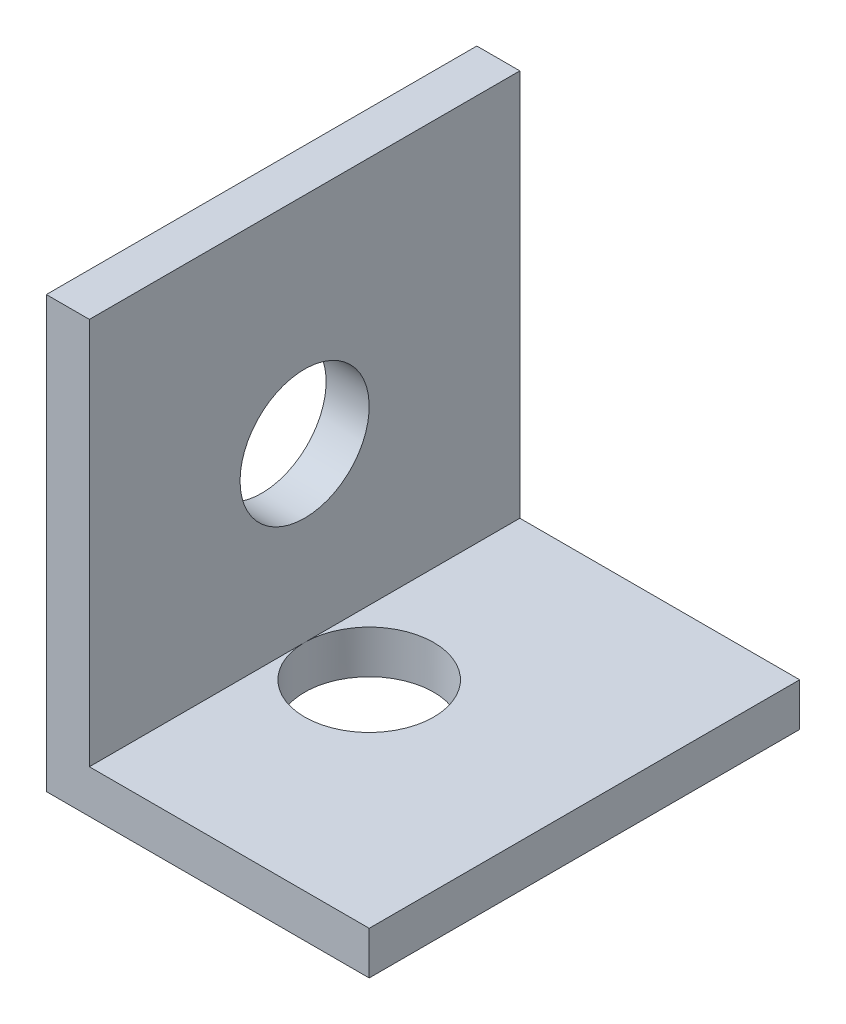
ISO-10303-21;
HEADER;
FILE_DESCRIPTION(('STEP AP214'),'2;1');
FILE_NAME('part.step','',(''),(''),'','','');
FILE_SCHEMA(('AUTOMOTIVE_DESIGN { 1 0 10303 214 1 1 1 1 }'));
ENDSEC;
DATA;
#1=APPLICATION_CONTEXT('core data for automotive mechanical design processes');
#2=APPLICATION_PROTOCOL_DEFINITION('international standard','automotive_design',2000,#1);
#3=PRODUCT_CONTEXT('',#1,'mechanical');
#4=PRODUCT('Part','Part','',(#3));
#5=PRODUCT_RELATED_PRODUCT_CATEGORY('part','',(#4));
#6=PRODUCT_DEFINITION_FORMATION('','',#4);
#7=PRODUCT_DEFINITION_CONTEXT('part definition',#1,'design');
#8=PRODUCT_DEFINITION('design','',#6,#7);
#9=PRODUCT_DEFINITION_SHAPE('','',#8);
#10=(LENGTH_UNIT() NAMED_UNIT(*) SI_UNIT(.MILLI.,.METRE.));
#11=(NAMED_UNIT(*) PLANE_ANGLE_UNIT() SI_UNIT($,.RADIAN.));
#12=(NAMED_UNIT(*) SI_UNIT($,.STERADIAN.) SOLID_ANGLE_UNIT());
#13=UNCERTAINTY_MEASURE_WITH_UNIT(LENGTH_MEASURE(1.E-05),#10,'distance_accuracy_value','');
#14=(GEOMETRIC_REPRESENTATION_CONTEXT(3) GLOBAL_UNCERTAINTY_ASSIGNED_CONTEXT((#13)) GLOBAL_UNIT_ASSIGNED_CONTEXT((#10,
#11,#12)) REPRESENTATION_CONTEXT('',''));
#15=CARTESIAN_POINT('',(0.,0.,0.));
#16=DIRECTION('',(0.,0.,1.));
#17=DIRECTION('',(1.,0.,0.));
#18=AXIS2_PLACEMENT_3D('',#15,#16,#17);
#19=CARTESIAN_POINT('',(15.,0.,10.));
#20=DIRECTION('',(0.,1.,0.));
#21=DIRECTION('',(-1.,0.,0.));
#22=AXIS2_PLACEMENT_3D('',#19,#20,#21);
#23=PLANE('',#22);
#24=CARTESIAN_POINT('',(5.,0.,0.));
#25=DIRECTION('',(0.,-1.,0.));
#26=DIRECTION('',(1.,0.,0.));
#27=AXIS2_PLACEMENT_3D('',#24,#25,#26);
#28=CIRCLE('',#27,3.);
#29=CARTESIAN_POINT('',(8.,0.,0.));
#30=VERTEX_POINT('',#29);
#31=EDGE_CURVE('E158',#30,#30,#28,.T.);
#32=ORIENTED_EDGE('',*,*,#31,.F.);
#33=EDGE_LOOP('',(#32));
#34=FACE_BOUND('',#33,.T.);
#35=DIRECTION('',(1.,0.,0.));
#36=VECTOR('',#35,1.);
#37=CARTESIAN_POINT('',(15.,0.,-10.));
#38=LINE('',#37,#36);
#39=CARTESIAN_POINT('',(0.,0.,-10.));
#40=VERTEX_POINT('',#39);
#41=CARTESIAN_POINT('',(15.,0.,-10.));
#42=VERTEX_POINT('',#41);
#43=EDGE_CURVE('E120',#40,#42,#38,.T.);
#44=ORIENTED_EDGE('',*,*,#43,.T.);
#45=DIRECTION('',(0.,0.,-1.));
#46=VECTOR('',#45,1.);
#47=CARTESIAN_POINT('',(15.,0.,10.));
#48=LINE('',#47,#46);
#49=CARTESIAN_POINT('',(15.,0.,10.));
#50=VERTEX_POINT('',#49);
#51=EDGE_CURVE('E11',#50,#42,#48,.T.);
#52=ORIENTED_EDGE('',*,*,#51,.F.);
#53=DIRECTION('',(1.,0.,0.));
#54=VECTOR('',#53,1.);
#55=CARTESIAN_POINT('',(15.,0.,10.));
#56=LINE('',#55,#54);
#57=CARTESIAN_POINT('',(0.,0.,10.));
#58=VERTEX_POINT('',#57);
#59=EDGE_CURVE('E133',#58,#50,#56,.T.);
#60=ORIENTED_EDGE('',*,*,#59,.F.);
#61=DIRECTION('',(0.,0.,-1.));
#62=VECTOR('',#61,1.);
#63=CARTESIAN_POINT('',(0.,0.,10.));
#64=LINE('',#63,#62);
#65=EDGE_CURVE('E116',#58,#40,#64,.T.);
#66=ORIENTED_EDGE('',*,*,#65,.T.);
#67=EDGE_LOOP('',(#44,#52,#60,#66));
#68=FACE_BOUND('',#67,.T.);
#69=ADVANCED_FACE('F31',(#34,#68),#23,.F.);
#70=CARTESIAN_POINT('',(15.,2.,10.));
#71=DIRECTION('',(-1.,0.,0.));
#72=DIRECTION('',(0.,0.,1.));
#73=AXIS2_PLACEMENT_3D('',#70,#71,#72);
#74=PLANE('',#73);
#75=DIRECTION('',(0.,1.,0.));
#76=VECTOR('',#75,1.);
#77=CARTESIAN_POINT('',(15.,2.,-10.));
#78=LINE('',#77,#76);
#79=CARTESIAN_POINT('',(15.,2.,-10.));
#80=VERTEX_POINT('',#79);
#81=EDGE_CURVE('E123',#42,#80,#78,.T.);
#82=ORIENTED_EDGE('',*,*,#81,.T.);
#83=DIRECTION('',(0.,0.,-1.));
#84=VECTOR('',#83,1.);
#85=CARTESIAN_POINT('',(15.,2.,10.));
#86=LINE('',#85,#84);
#87=CARTESIAN_POINT('',(15.,2.,10.));
#88=VERTEX_POINT('',#87);
#89=EDGE_CURVE('E38',#88,#80,#86,.T.);
#90=ORIENTED_EDGE('',*,*,#89,.F.);
#91=DIRECTION('',(0.,1.,0.));
#92=VECTOR('',#91,1.);
#93=CARTESIAN_POINT('',(15.,2.,10.));
#94=LINE('',#93,#92);
#95=EDGE_CURVE('E85',#50,#88,#94,.T.);
#96=ORIENTED_EDGE('',*,*,#95,.F.);
#97=ORIENTED_EDGE('',*,*,#51,.T.);
#98=EDGE_LOOP('',(#82,#90,#96,#97));
#99=FACE_BOUND('',#98,.T.);
#100=ADVANCED_FACE('F165',(#99),#74,.F.);
#101=CARTESIAN_POINT('',(2.00000000000001,2.,10.));
#102=DIRECTION('',(0.,-1.,0.));
#103=DIRECTION('',(1.,0.,0.));
#104=AXIS2_PLACEMENT_3D('',#101,#102,#103);
#105=PLANE('',#104);
#106=DIRECTION('',(0.,0.,-1.));
#107=VECTOR('',#106,1.);
#108=CARTESIAN_POINT('',(2.00000000000001,2.,10.));
#109=LINE('',#108,#107);
#110=CARTESIAN_POINT('',(2.00000000000001,2.,0.));
#111=VERTEX_POINT('',#110);
#112=CARTESIAN_POINT('',(2.00000000000001,2.,-10.));
#113=VERTEX_POINT('',#112);
#114=EDGE_CURVE('E111',#111,#113,#109,.T.);
#115=ORIENTED_EDGE('',*,*,#114,.F.);
#116=CARTESIAN_POINT('',(5.,2.,0.));
#117=DIRECTION('',(0.,-1.,0.));
#118=DIRECTION('',(1.,0.,0.));
#119=AXIS2_PLACEMENT_3D('',#116,#117,#118);
#120=CIRCLE('',#119,3.);
#121=EDGE_CURVE('E43',#111,#111,#120,.F.);
#122=ORIENTED_EDGE('',*,*,#121,.F.);
#123=CARTESIAN_POINT('',(2.00000000000001,2.,10.));
#124=VERTEX_POINT('',#123);
#125=EDGE_CURVE('E136',#124,#111,#109,.T.);
#126=ORIENTED_EDGE('',*,*,#125,.F.);
#127=DIRECTION('',(-1.,0.,0.));
#128=VECTOR('',#127,1.);
#129=CARTESIAN_POINT('',(2.00000000000001,2.,10.));
#130=LINE('',#129,#128);
#131=EDGE_CURVE('E99',#88,#124,#130,.T.);
#132=ORIENTED_EDGE('',*,*,#131,.F.);
#133=ORIENTED_EDGE('',*,*,#89,.T.);
#134=DIRECTION('',(-1.,0.,0.));
#135=VECTOR('',#134,1.);
#136=CARTESIAN_POINT('',(2.00000000000001,2.,-10.));
#137=LINE('',#136,#135);
#138=EDGE_CURVE('E126',#80,#113,#137,.T.);
#139=ORIENTED_EDGE('',*,*,#138,.T.);
#140=EDGE_LOOP('',(#115,#122,#126,#132,#133,#139));
#141=FACE_BOUND('',#140,.T.);
#142=ADVANCED_FACE('F141',(#141),#105,.F.);
#143=CARTESIAN_POINT('',(2.,20.,10.));
#144=DIRECTION('',(-1.,0.,0.));
#145=DIRECTION('',(0.,-1.,0.));
#146=AXIS2_PLACEMENT_3D('',#143,#144,#145);
#147=PLANE('',#146);
#148=CARTESIAN_POINT('',(2.,10.,0.));
#149=DIRECTION('',(-1.,0.,0.));
#150=DIRECTION('',(0.,-1.,0.));
#151=AXIS2_PLACEMENT_3D('',#148,#149,#150);
#152=CIRCLE('',#151,3.);
#153=CARTESIAN_POINT('',(2.,7.,0.));
#154=VERTEX_POINT('',#153);
#155=EDGE_CURVE('E124',#154,#154,#152,.F.);
#156=ORIENTED_EDGE('',*,*,#155,.F.);
#157=EDGE_LOOP('',(#156));
#158=FACE_BOUND('',#157,.T.);
#159=DIRECTION('',(0.,1.,0.));
#160=VECTOR('',#159,1.);
#161=CARTESIAN_POINT('',(2.,20.,-10.));
#162=LINE('',#161,#160);
#163=CARTESIAN_POINT('',(2.,20.,-10.));
#164=VERTEX_POINT('',#163);
#165=EDGE_CURVE('E108',#113,#164,#162,.T.);
#166=ORIENTED_EDGE('',*,*,#165,.T.);
#167=DIRECTION('',(0.,0.,-1.));
#168=VECTOR('',#167,1.);
#169=CARTESIAN_POINT('',(2.,20.,10.));
#170=LINE('',#169,#168);
#171=CARTESIAN_POINT('',(2.,20.,10.));
#172=VERTEX_POINT('',#171);
#173=EDGE_CURVE('E105',#172,#164,#170,.T.);
#174=ORIENTED_EDGE('',*,*,#173,.F.);
#175=DIRECTION('',(0.,1.,0.));
#176=VECTOR('',#175,1.);
#177=CARTESIAN_POINT('',(2.,20.,10.));
#178=LINE('',#177,#176);
#179=EDGE_CURVE('E92',#124,#172,#178,.T.);
#180=ORIENTED_EDGE('',*,*,#179,.F.);
#181=ORIENTED_EDGE('',*,*,#125,.T.);
#182=ORIENTED_EDGE('',*,*,#114,.T.);
#183=EDGE_LOOP('',(#166,#174,#180,#181,#182));
#184=FACE_BOUND('',#183,.T.);
#185=ADVANCED_FACE('F106',(#158,#184),#147,.F.);
#186=CARTESIAN_POINT('',(0.,20.,10.));
#187=DIRECTION('',(0.,-1.,0.));
#188=DIRECTION('',(0.,0.,-1.));
#189=AXIS2_PLACEMENT_3D('',#186,#187,#188);
#190=PLANE('',#189);
#191=DIRECTION('',(-1.,0.,0.));
#192=VECTOR('',#191,1.);
#193=CARTESIAN_POINT('',(0.,20.,-10.));
#194=LINE('',#193,#192);
#195=CARTESIAN_POINT('',(0.,20.,-10.));
#196=VERTEX_POINT('',#195);
#197=EDGE_CURVE('E130',#164,#196,#194,.T.);
#198=ORIENTED_EDGE('',*,*,#197,.T.);
#199=DIRECTION('',(0.,0.,-1.));
#200=VECTOR('',#199,1.);
#201=CARTESIAN_POINT('',(0.,20.,10.));
#202=LINE('',#201,#200);
#203=CARTESIAN_POINT('',(0.,20.,10.));
#204=VERTEX_POINT('',#203);
#205=EDGE_CURVE('E112',#204,#196,#202,.T.);
#206=ORIENTED_EDGE('',*,*,#205,.F.);
#207=DIRECTION('',(-1.,0.,0.));
#208=VECTOR('',#207,1.);
#209=CARTESIAN_POINT('',(0.,20.,10.));
#210=LINE('',#209,#208);
#211=EDGE_CURVE('E96',#172,#204,#210,.T.);
#212=ORIENTED_EDGE('',*,*,#211,.F.);
#213=ORIENTED_EDGE('',*,*,#173,.T.);
#214=EDGE_LOOP('',(#198,#206,#212,#213));
#215=FACE_BOUND('',#214,.T.);
#216=ADVANCED_FACE('F114',(#215),#190,.F.);
#217=CARTESIAN_POINT('',(0.,0.,10.));
#218=DIRECTION('',(1.,0.,0.));
#219=DIRECTION('',(0.,0.,-1.));
#220=AXIS2_PLACEMENT_3D('',#217,#218,#219);
#221=PLANE('',#220);
#222=CARTESIAN_POINT('',(0.,10.,0.));
#223=DIRECTION('',(-1.,0.,0.));
#224=DIRECTION('',(0.,0.,1.));
#225=AXIS2_PLACEMENT_3D('',#222,#223,#224);
#226=CIRCLE('',#225,3.);
#227=CARTESIAN_POINT('',(0.,10.,3.));
#228=VERTEX_POINT('',#227);
#229=EDGE_CURVE('E154',#228,#228,#226,.T.);
#230=ORIENTED_EDGE('',*,*,#229,.F.);
#231=EDGE_LOOP('',(#230));
#232=FACE_BOUND('',#231,.T.);
#233=DIRECTION('',(0.,-1.,0.));
#234=VECTOR('',#233,1.);
#235=CARTESIAN_POINT('',(0.,0.,-10.));
#236=LINE('',#235,#234);
#237=EDGE_CURVE('E77',#196,#40,#236,.T.);
#238=ORIENTED_EDGE('',*,*,#237,.T.);
#239=ORIENTED_EDGE('',*,*,#65,.F.);
#240=DIRECTION('',(0.,-1.,0.));
#241=VECTOR('',#240,1.);
#242=CARTESIAN_POINT('',(0.,0.,10.));
#243=LINE('',#242,#241);
#244=EDGE_CURVE('E51',#204,#58,#243,.T.);
#245=ORIENTED_EDGE('',*,*,#244,.F.);
#246=ORIENTED_EDGE('',*,*,#205,.T.);
#247=EDGE_LOOP('',(#238,#239,#245,#246));
#248=FACE_BOUND('',#247,.T.);
#249=ADVANCED_FACE('F145',(#232,#248),#221,.F.);
#250=CARTESIAN_POINT('',(0.,0.,10.));
#251=DIRECTION('',(0.,0.,-1.));
#252=DIRECTION('',(-1.,0.,0.));
#253=AXIS2_PLACEMENT_3D('',#250,#251,#252);
#254=PLANE('',#253);
#255=ORIENTED_EDGE('',*,*,#59,.T.);
#256=ORIENTED_EDGE('',*,*,#95,.T.);
#257=ORIENTED_EDGE('',*,*,#131,.T.);
#258=ORIENTED_EDGE('',*,*,#179,.T.);
#259=ORIENTED_EDGE('',*,*,#211,.T.);
#260=ORIENTED_EDGE('',*,*,#244,.T.);
#261=EDGE_LOOP('',(#255,#256,#257,#258,#259,#260));
#262=FACE_BOUND('',#261,.T.);
#263=ADVANCED_FACE('F94',(#262),#254,.F.);
#264=CARTESIAN_POINT('',(0.,0.,-10.));
#265=DIRECTION('',(0.,0.,-1.));
#266=DIRECTION('',(-1.,0.,0.));
#267=AXIS2_PLACEMENT_3D('',#264,#265,#266);
#268=PLANE('',#267);
#269=ORIENTED_EDGE('',*,*,#43,.F.);
#270=ORIENTED_EDGE('',*,*,#237,.F.);
#271=ORIENTED_EDGE('',*,*,#197,.F.);
#272=ORIENTED_EDGE('',*,*,#165,.F.);
#273=ORIENTED_EDGE('',*,*,#138,.F.);
#274=ORIENTED_EDGE('',*,*,#81,.F.);
#275=EDGE_LOOP('',(#269,#270,#271,#272,#273,#274));
#276=FACE_BOUND('',#275,.T.);
#277=ADVANCED_FACE('F144',(#276),#268,.T.);
#278=CARTESIAN_POINT('',(10.4852813742386,10.,0.));
#279=DIRECTION('',(-1.,0.,0.));
#280=DIRECTION('',(0.,0.,1.));
#281=AXIS2_PLACEMENT_3D('',#278,#279,#280);
#282=CYLINDRICAL_SURFACE('',#281,3.);
#283=ORIENTED_EDGE('',*,*,#155,.T.);
#284=EDGE_LOOP('',(#283));
#285=FACE_BOUND('',#284,.T.);
#286=ORIENTED_EDGE('',*,*,#229,.T.);
#287=EDGE_LOOP('',(#286));
#288=FACE_BOUND('',#287,.T.);
#289=ADVANCED_FACE('F184',(#285,#288),#282,.F.);
#290=CARTESIAN_POINT('',(5.,10.4852813742386,0.));
#291=DIRECTION('',(0.,-1.,0.));
#292=DIRECTION('',(1.,0.,0.));
#293=AXIS2_PLACEMENT_3D('',#290,#291,#292);
#294=CYLINDRICAL_SURFACE('',#293,3.);
#295=ORIENTED_EDGE('',*,*,#121,.T.);
#296=EDGE_LOOP('',(#295));
#297=FACE_BOUND('',#296,.T.);
#298=ORIENTED_EDGE('',*,*,#31,.T.);
#299=EDGE_LOOP('',(#298));
#300=FACE_BOUND('',#299,.T.);
#301=ADVANCED_FACE('F162',(#297,#300),#294,.F.);
#302=CLOSED_SHELL('',(#69,#100,#142,#185,#216,#249,#263,#277,#289,#301));
#303=MANIFOLD_SOLID_BREP('B2',#302);
#304=ADVANCED_BREP_SHAPE_REPRESENTATION('',(#18,#303),#14);
#305=SHAPE_DEFINITION_REPRESENTATION(#9,#304);
ENDSEC;
END-ISO-10303-21;
